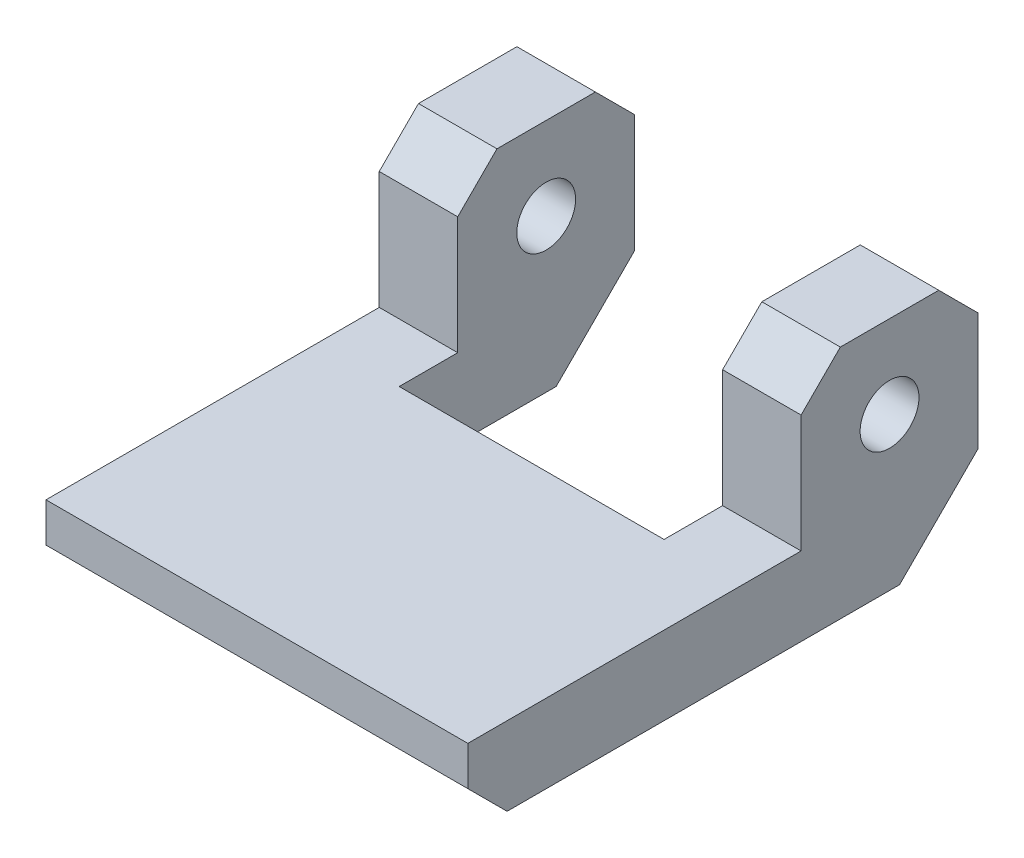
ISO-10303-21;
HEADER;
FILE_DESCRIPTION(('STEP AP214'),'2;1');
FILE_NAME('part.step','',(''),(''),'','','');
FILE_SCHEMA(('AUTOMOTIVE_DESIGN { 1 0 10303 214 1 1 1 1 }'));
ENDSEC;
DATA;
#1=APPLICATION_CONTEXT('core data for automotive mechanical design processes');
#2=APPLICATION_PROTOCOL_DEFINITION('international standard','automotive_design',2000,#1);
#3=PRODUCT_CONTEXT('',#1,'mechanical');
#4=PRODUCT('Part','Part','',(#3));
#5=PRODUCT_RELATED_PRODUCT_CATEGORY('part','',(#4));
#6=PRODUCT_DEFINITION_FORMATION('','',#4);
#7=PRODUCT_DEFINITION_CONTEXT('part definition',#1,'design');
#8=PRODUCT_DEFINITION('design','',#6,#7);
#9=PRODUCT_DEFINITION_SHAPE('','',#8);
#10=(LENGTH_UNIT() NAMED_UNIT(*) SI_UNIT(.MILLI.,.METRE.));
#11=(NAMED_UNIT(*) PLANE_ANGLE_UNIT() SI_UNIT($,.RADIAN.));
#12=(NAMED_UNIT(*) SI_UNIT($,.STERADIAN.) SOLID_ANGLE_UNIT());
#13=UNCERTAINTY_MEASURE_WITH_UNIT(LENGTH_MEASURE(1.E-05),#10,'distance_accuracy_value','');
#14=(GEOMETRIC_REPRESENTATION_CONTEXT(3) GLOBAL_UNCERTAINTY_ASSIGNED_CONTEXT((#13)) GLOBAL_UNIT_ASSIGNED_CONTEXT((#10,
#11,#12)) REPRESENTATION_CONTEXT('',''));
#15=CARTESIAN_POINT('',(0.,0.,0.));
#16=DIRECTION('',(0.,0.,1.));
#17=DIRECTION('',(1.,0.,0.));
#18=AXIS2_PLACEMENT_3D('',#15,#16,#17);
#19=CARTESIAN_POINT('',(0.,12.,0.));
#20=DIRECTION('',(0.,0.,1.));
#21=DIRECTION('',(1.,0.,0.));
#22=AXIS2_PLACEMENT_3D('',#19,#20,#21);
#23=PLANE('',#22);
#24=DIRECTION('',(-1.,0.,0.));
#25=VECTOR('',#24,1.);
#26=CARTESIAN_POINT('',(0.,4.,0.));
#27=LINE('',#26,#25);
#28=CARTESIAN_POINT('',(21.5,4.00000000000001,0.));
#29=VERTEX_POINT('',#28);
#30=CARTESIAN_POINT('',(17.5,4.,0.));
#31=VERTEX_POINT('',#30);
#32=EDGE_CURVE('E293',#29,#31,#27,.T.);
#33=ORIENTED_EDGE('',*,*,#32,.T.);
#34=DIRECTION('',(0.,1.,0.));
#35=VECTOR('',#34,1.);
#36=CARTESIAN_POINT('',(17.5,12.,0.));
#37=LINE('',#36,#35);
#38=CARTESIAN_POINT('',(17.5,9.99999999999999,0.));
#39=VERTEX_POINT('',#38);
#40=EDGE_CURVE('E209',#31,#39,#37,.T.);
#41=ORIENTED_EDGE('',*,*,#40,.T.);
#42=DIRECTION('',(1.,0.,0.));
#43=VECTOR('',#42,1.);
#44=CARTESIAN_POINT('',(21.5,9.99999999999999,0.));
#45=LINE('',#44,#43);
#46=CARTESIAN_POINT('',(21.5,9.99999999999999,0.));
#47=VERTEX_POINT('',#46);
#48=EDGE_CURVE('E280',#39,#47,#45,.T.);
#49=ORIENTED_EDGE('',*,*,#48,.T.);
#50=DIRECTION('',(0.,-1.,0.));
#51=VECTOR('',#50,1.);
#52=CARTESIAN_POINT('',(21.5,12.,0.));
#53=LINE('',#52,#51);
#54=EDGE_CURVE('E260',#47,#29,#53,.T.);
#55=ORIENTED_EDGE('',*,*,#54,.T.);
#56=EDGE_LOOP('',(#33,#41,#49,#55));
#57=FACE_BOUND('',#56,.T.);
#58=ADVANCED_FACE('F31',(#57),#23,.F.);
#59=CARTESIAN_POINT('',(0.,12.,26.));
#60=DIRECTION('',(0.,1.,0.));
#61=DIRECTION('',(0.,0.,1.));
#62=AXIS2_PLACEMENT_3D('',#59,#60,#61);
#63=PLANE('',#62);
#64=DIRECTION('',(0.,0.,-1.));
#65=VECTOR('',#64,1.);
#66=CARTESIAN_POINT('',(17.5,12.,-6.03252210902597));
#67=LINE('',#66,#65);
#68=CARTESIAN_POINT('',(17.5,12.,7.01626105451298));
#69=VERTEX_POINT('',#68);
#70=CARTESIAN_POINT('',(17.5,12.,2.));
#71=VERTEX_POINT('',#70);
#72=EDGE_CURVE('E188',#69,#71,#67,.T.);
#73=ORIENTED_EDGE('',*,*,#72,.F.);
#74=DIRECTION('',(1.,0.,0.));
#75=VECTOR('',#74,1.);
#76=CARTESIAN_POINT('',(21.5,12.,7.01626105451298));
#77=LINE('',#76,#75);
#78=CARTESIAN_POINT('',(21.5,12.,7.01626105451298));
#79=VERTEX_POINT('',#78);
#80=EDGE_CURVE('E268',#69,#79,#77,.T.);
#81=ORIENTED_EDGE('',*,*,#80,.T.);
#82=DIRECTION('',(0.,0.,-1.));
#83=VECTOR('',#82,1.);
#84=CARTESIAN_POINT('',(21.5,12.,0.));
#85=LINE('',#84,#83);
#86=CARTESIAN_POINT('',(21.5,12.,2.));
#87=VERTEX_POINT('',#86);
#88=EDGE_CURVE('E251',#79,#87,#85,.T.);
#89=ORIENTED_EDGE('',*,*,#88,.T.);
#90=DIRECTION('',(-1.,0.,0.));
#91=VECTOR('',#90,1.);
#92=CARTESIAN_POINT('',(0.,12.,2.));
#93=LINE('',#92,#91);
#94=EDGE_CURVE('E273',#87,#71,#93,.T.);
#95=ORIENTED_EDGE('',*,*,#94,.T.);
#96=EDGE_LOOP('',(#73,#81,#89,#95));
#97=FACE_BOUND('',#96,.T.);
#98=ADVANCED_FACE('F334',(#97),#63,.T.);
#99=CARTESIAN_POINT('',(0.,13.0176696078048,9.01626105451299));
#100=DIRECTION('',(0.,0.,-1.));
#101=DIRECTION('',(0.,1.,0.));
#102=AXIS2_PLACEMENT_3D('',#99,#100,#101);
#103=PLANE('',#102);
#104=DIRECTION('',(-1.,0.,0.));
#105=VECTOR('',#104,1.);
#106=CARTESIAN_POINT('',(0.,10.,9.01626105451299));
#107=LINE('',#106,#105);
#108=CARTESIAN_POINT('',(21.5,10.,9.01626105451299));
#109=VERTEX_POINT('',#108);
#110=CARTESIAN_POINT('',(17.5,10.,9.01626105451299));
#111=VERTEX_POINT('',#110);
#112=EDGE_CURVE('E289',#109,#111,#107,.T.);
#113=ORIENTED_EDGE('',*,*,#112,.T.);
#114=DIRECTION('',(0.,-1.,0.));
#115=VECTOR('',#114,1.);
#116=CARTESIAN_POINT('',(17.5,13.0176696078048,9.01626105451299));
#117=LINE('',#116,#115);
#118=CARTESIAN_POINT('',(17.5,4.,9.01626105451299));
#119=VERTEX_POINT('',#118);
#120=EDGE_CURVE('E216',#111,#119,#117,.T.);
#121=ORIENTED_EDGE('',*,*,#120,.T.);
#122=DIRECTION('',(1.,0.,0.));
#123=VECTOR('',#122,1.);
#124=CARTESIAN_POINT('',(0.,4.,9.01626105451299));
#125=LINE('',#124,#123);
#126=CARTESIAN_POINT('',(21.5,4.,9.01626105451299));
#127=VERTEX_POINT('',#126);
#128=EDGE_CURVE('E236',#119,#127,#125,.T.);
#129=ORIENTED_EDGE('',*,*,#128,.T.);
#130=DIRECTION('',(0.,1.,0.));
#131=VECTOR('',#130,1.);
#132=CARTESIAN_POINT('',(21.5,13.0176696078048,9.01626105451299));
#133=LINE('',#132,#131);
#134=EDGE_CURVE('E233',#127,#109,#133,.T.);
#135=ORIENTED_EDGE('',*,*,#134,.T.);
#136=EDGE_LOOP('',(#113,#121,#129,#135));
#137=FACE_BOUND('',#136,.T.);
#138=ADVANCED_FACE('F341',(#137),#103,.F.);
#139=CARTESIAN_POINT('',(0.,12.,2.));
#140=DIRECTION('',(0.,0.707106781186546,-0.707106781186549));
#141=DIRECTION('',(0.,0.707106781186549,0.707106781186546));
#142=AXIS2_PLACEMENT_3D('',#139,#140,#141);
#143=PLANE('',#142);
#144=DIRECTION('',(0.,-0.707106781186549,-0.707106781186546));
#145=VECTOR('',#144,1.);
#146=CARTESIAN_POINT('',(17.5,12.,2.));
#147=LINE('',#146,#145);
#148=EDGE_CURVE('E212',#71,#39,#147,.T.);
#149=ORIENTED_EDGE('',*,*,#148,.F.);
#150=ORIENTED_EDGE('',*,*,#94,.F.);
#151=DIRECTION('',(0.,0.707106781186549,0.707106781186546));
#152=VECTOR('',#151,1.);
#153=CARTESIAN_POINT('',(21.5,12.,2.));
#154=LINE('',#153,#152);
#155=EDGE_CURVE('E286',#47,#87,#154,.T.);
#156=ORIENTED_EDGE('',*,*,#155,.F.);
#157=ORIENTED_EDGE('',*,*,#48,.F.);
#158=EDGE_LOOP('',(#149,#150,#156,#157));
#159=FACE_BOUND('',#158,.T.);
#160=ADVANCED_FACE('F387',(#159),#143,.T.);
#161=CARTESIAN_POINT('',(0.,10.,9.01626105451299));
#162=DIRECTION('',(0.,0.707106781186549,0.707106781186546));
#163=DIRECTION('',(0.,-0.707106781186546,0.707106781186549));
#164=AXIS2_PLACEMENT_3D('',#161,#162,#163);
#165=PLANE('',#164);
#166=DIRECTION('',(0.,0.707106781186546,-0.707106781186549));
#167=VECTOR('',#166,1.);
#168=CARTESIAN_POINT('',(17.5,10.,9.01626105451299));
#169=LINE('',#168,#167);
#170=EDGE_CURVE('E214',#111,#69,#169,.T.);
#171=ORIENTED_EDGE('',*,*,#170,.F.);
#172=ORIENTED_EDGE('',*,*,#112,.F.);
#173=DIRECTION('',(0.,-0.707106781186546,0.707106781186549));
#174=VECTOR('',#173,1.);
#175=CARTESIAN_POINT('',(21.5,10.,9.01626105451299));
#176=LINE('',#175,#174);
#177=EDGE_CURVE('E284',#79,#109,#176,.T.);
#178=ORIENTED_EDGE('',*,*,#177,.F.);
#179=ORIENTED_EDGE('',*,*,#80,.F.);
#180=EDGE_LOOP('',(#171,#172,#178,#179));
#181=FACE_BOUND('',#180,.T.);
#182=ADVANCED_FACE('F395',(#181),#165,.T.);
#183=CARTESIAN_POINT('',(0.,4.,0.));
#184=DIRECTION('',(0.,0.707106781186549,0.707106781186546));
#185=DIRECTION('',(0.,-0.707106781186546,0.707106781186549));
#186=AXIS2_PLACEMENT_3D('',#183,#184,#185);
#187=PLANE('',#186);
#188=DIRECTION('',(0.,0.707106781186546,-0.707106781186549));
#189=VECTOR('',#188,1.);
#190=CARTESIAN_POINT('',(17.5,4.,0.));
#191=LINE('',#190,#189);
#192=CARTESIAN_POINT('',(17.5,0.,4.00000000000002));
#193=VERTEX_POINT('',#192);
#194=EDGE_CURVE('E207',#31,#193,#191,.F.);
#195=ORIENTED_EDGE('',*,*,#194,.F.);
#196=ORIENTED_EDGE('',*,*,#32,.F.);
#197=DIRECTION('',(0.,-0.707106781186546,0.707106781186549));
#198=VECTOR('',#197,1.);
#199=CARTESIAN_POINT('',(21.5,4.00000000000001,0.));
#200=LINE('',#199,#198);
#201=CARTESIAN_POINT('',(21.5,0.,4.00000000000002));
#202=VERTEX_POINT('',#201);
#203=EDGE_CURVE('E300',#202,#29,#200,.F.);
#204=ORIENTED_EDGE('',*,*,#203,.F.);
#205=DIRECTION('',(1.,0.,0.));
#206=VECTOR('',#205,1.);
#207=CARTESIAN_POINT('',(0.,0.,4.00000000000002));
#208=LINE('',#207,#206);
#209=EDGE_CURVE('E298',#193,#202,#208,.T.);
#210=ORIENTED_EDGE('',*,*,#209,.F.);
#211=EDGE_LOOP('',(#195,#196,#204,#210));
#212=FACE_BOUND('',#211,.T.);
#213=ADVANCED_FACE('F380',(#212),#187,.F.);
#214=CARTESIAN_POINT('',(0.,7.77705431232267,4.50813052725649));
#215=DIRECTION('',(1.,0.,0.));
#216=DIRECTION('',(0.,0.,-1.));
#217=AXIS2_PLACEMENT_3D('',#214,#215,#216);
#218=CYLINDRICAL_SURFACE('',#217,1.5);
#219=CARTESIAN_POINT('',(17.5,7.77705431232267,4.50813052725649));
#220=DIRECTION('',(1.,0.,0.));
#221=DIRECTION('',(0.,0.,-1.));
#222=AXIS2_PLACEMENT_3D('',#219,#220,#221);
#223=CIRCLE('',#222,1.5);
#224=CARTESIAN_POINT('',(17.5,7.77705431232267,3.00813052725649));
#225=VERTEX_POINT('',#224);
#226=EDGE_CURVE('E206',#225,#225,#223,.F.);
#227=ORIENTED_EDGE('',*,*,#226,.T.);
#228=EDGE_LOOP('',(#227));
#229=FACE_BOUND('',#228,.T.);
#230=CARTESIAN_POINT('',(21.5,7.77705431232267,4.50813052725649));
#231=DIRECTION('',(1.,0.,0.));
#232=DIRECTION('',(0.,0.,-1.));
#233=AXIS2_PLACEMENT_3D('',#230,#231,#232);
#234=CIRCLE('',#233,1.5);
#235=CARTESIAN_POINT('',(21.5,7.77705431232267,3.00813052725649));
#236=VERTEX_POINT('',#235);
#237=EDGE_CURVE('E222',#236,#236,#234,.T.);
#238=ORIENTED_EDGE('',*,*,#237,.T.);
#239=EDGE_LOOP('',(#238));
#240=FACE_BOUND('',#239,.T.);
#241=ADVANCED_FACE('F466',(#229,#240),#218,.F.);
#242=CARTESIAN_POINT('',(0.,12.,0.));
#243=DIRECTION('',(1.,0.,0.));
#244=DIRECTION('',(0.,0.,-1.));
#245=AXIS2_PLACEMENT_3D('',#242,#243,#244);
#246=PLANE('',#245);
#247=CARTESIAN_POINT('',(0.,7.77705431232267,4.50813052725649));
#248=DIRECTION('',(1.,0.,0.));
#249=DIRECTION('',(0.,0.,-1.));
#250=AXIS2_PLACEMENT_3D('',#247,#248,#249);
#251=CIRCLE('',#250,1.5);
#252=CARTESIAN_POINT('',(0.,7.77705431232267,3.00813052725649));
#253=VERTEX_POINT('',#252);
#254=EDGE_CURVE('E223',#253,#253,#251,.T.);
#255=ORIENTED_EDGE('',*,*,#254,.T.);
#256=EDGE_LOOP('',(#255));
#257=FACE_BOUND('',#256,.T.);
#258=DIRECTION('',(0.,0.,1.));
#259=VECTOR('',#258,1.);
#260=CARTESIAN_POINT('',(0.,0.,0.));
#261=LINE('',#260,#259);
#262=CARTESIAN_POINT('',(0.,0.,4.00000000000002));
#263=VERTEX_POINT('',#262);
#264=CARTESIAN_POINT('',(0.,0.,24.));
#265=VERTEX_POINT('',#264);
#266=EDGE_CURVE('E247',#263,#265,#261,.T.);
#267=ORIENTED_EDGE('',*,*,#266,.T.);
#268=DIRECTION('',(0.,-0.707106781186546,-0.707106781186549));
#269=VECTOR('',#268,1.);
#270=CARTESIAN_POINT('',(0.,1.99999999999999,26.));
#271=LINE('',#270,#269);
#272=CARTESIAN_POINT('',(0.,1.99999999999999,26.));
#273=VERTEX_POINT('',#272);
#274=EDGE_CURVE('E11',#265,#273,#271,.F.);
#275=ORIENTED_EDGE('',*,*,#274,.T.);
#276=DIRECTION('',(0.,-1.,0.));
#277=VECTOR('',#276,1.);
#278=CARTESIAN_POINT('',(0.,12.,26.));
#279=LINE('',#278,#277);
#280=CARTESIAN_POINT('',(0.,4.,26.));
#281=VERTEX_POINT('',#280);
#282=EDGE_CURVE('E265',#281,#273,#279,.T.);
#283=ORIENTED_EDGE('',*,*,#282,.F.);
#284=DIRECTION('',(0.,0.,-1.));
#285=VECTOR('',#284,1.);
#286=CARTESIAN_POINT('',(0.,4.,31.4384801314986));
#287=LINE('',#286,#285);
#288=CARTESIAN_POINT('',(0.,4.,9.01626105451299));
#289=VERTEX_POINT('',#288);
#290=EDGE_CURVE('E229',#281,#289,#287,.T.);
#291=ORIENTED_EDGE('',*,*,#290,.T.);
#292=DIRECTION('',(0.,1.,0.));
#293=VECTOR('',#292,1.);
#294=CARTESIAN_POINT('',(0.,13.0176696078048,9.01626105451299));
#295=LINE('',#294,#293);
#296=CARTESIAN_POINT('',(0.,10.,9.01626105451299));
#297=VERTEX_POINT('',#296);
#298=EDGE_CURVE('E232',#289,#297,#295,.T.);
#299=ORIENTED_EDGE('',*,*,#298,.T.);
#300=DIRECTION('',(0.,0.707106781186546,-0.707106781186549));
#301=VECTOR('',#300,1.);
#302=CARTESIAN_POINT('',(0.,10.,9.01626105451299));
#303=LINE('',#302,#301);
#304=CARTESIAN_POINT('',(0.,12.,7.01626105451298));
#305=VERTEX_POINT('',#304);
#306=EDGE_CURVE('E276',#297,#305,#303,.T.);
#307=ORIENTED_EDGE('',*,*,#306,.T.);
#308=DIRECTION('',(0.,0.,1.));
#309=VECTOR('',#308,1.);
#310=CARTESIAN_POINT('',(0.,12.,0.));
#311=LINE('',#310,#309);
#312=CARTESIAN_POINT('',(0.,12.,2.));
#313=VERTEX_POINT('',#312);
#314=EDGE_CURVE('E248',#313,#305,#311,.T.);
#315=ORIENTED_EDGE('',*,*,#314,.F.);
#316=DIRECTION('',(0.,-0.707106781186549,-0.707106781186546));
#317=VECTOR('',#316,1.);
#318=CARTESIAN_POINT('',(0.,12.,2.));
#319=LINE('',#318,#317);
#320=CARTESIAN_POINT('',(0.,9.99999999999999,0.));
#321=VERTEX_POINT('',#320);
#322=EDGE_CURVE('E278',#313,#321,#319,.T.);
#323=ORIENTED_EDGE('',*,*,#322,.T.);
#324=DIRECTION('',(0.,-1.,0.));
#325=VECTOR('',#324,1.);
#326=CARTESIAN_POINT('',(0.,12.,0.));
#327=LINE('',#326,#325);
#328=CARTESIAN_POINT('',(0.,4.00000000000001,0.));
#329=VERTEX_POINT('',#328);
#330=EDGE_CURVE('E255',#321,#329,#327,.T.);
#331=ORIENTED_EDGE('',*,*,#330,.T.);
#332=DIRECTION('',(0.,0.707106781186546,-0.707106781186549));
#333=VECTOR('',#332,1.);
#334=CARTESIAN_POINT('',(0.,4.,0.));
#335=LINE('',#334,#333);
#336=EDGE_CURVE('E296',#329,#263,#335,.F.);
#337=ORIENTED_EDGE('',*,*,#336,.T.);
#338=EDGE_LOOP('',(#267,#275,#283,#291,#299,#307,#315,#323,#331,#337));
#339=FACE_BOUND('',#338,.T.);
#340=ADVANCED_FACE('F325',(#257,#339),#246,.F.);
#341=CARTESIAN_POINT('',(0.,12.,26.));
#342=DIRECTION('',(0.,0.,-1.));
#343=DIRECTION('',(-1.,0.,0.));
#344=AXIS2_PLACEMENT_3D('',#341,#342,#343);
#345=PLANE('',#344);
#346=ORIENTED_EDGE('',*,*,#282,.T.);
#347=DIRECTION('',(1.,0.,0.));
#348=VECTOR('',#347,1.);
#349=CARTESIAN_POINT('',(0.,1.99999999999999,26.));
#350=LINE('',#349,#348);
#351=CARTESIAN_POINT('',(21.5,1.99999999999999,26.));
#352=VERTEX_POINT('',#351);
#353=EDGE_CURVE('E308',#273,#352,#350,.T.);
#354=ORIENTED_EDGE('',*,*,#353,.T.);
#355=DIRECTION('',(0.,-1.,0.));
#356=VECTOR('',#355,1.);
#357=CARTESIAN_POINT('',(21.5,12.,26.));
#358=LINE('',#357,#356);
#359=CARTESIAN_POINT('',(21.5,4.,26.));
#360=VERTEX_POINT('',#359);
#361=EDGE_CURVE('E263',#360,#352,#358,.T.);
#362=ORIENTED_EDGE('',*,*,#361,.F.);
#363=DIRECTION('',(-1.,0.,0.));
#364=VECTOR('',#363,1.);
#365=CARTESIAN_POINT('',(0.,4.,26.));
#366=LINE('',#365,#364);
#367=EDGE_CURVE('E244',#360,#281,#366,.T.);
#368=ORIENTED_EDGE('',*,*,#367,.T.);
#369=EDGE_LOOP('',(#346,#354,#362,#368));
#370=FACE_BOUND('',#369,.T.);
#371=ADVANCED_FACE('F314',(#370),#345,.F.);
#372=CARTESIAN_POINT('',(21.5,12.,0.));
#373=DIRECTION('',(-1.,0.,0.));
#374=DIRECTION('',(0.,0.,1.));
#375=AXIS2_PLACEMENT_3D('',#372,#373,#374);
#376=PLANE('',#375);
#377=ORIENTED_EDGE('',*,*,#237,.F.);
#378=EDGE_LOOP('',(#377));
#379=FACE_BOUND('',#378,.T.);
#380=ORIENTED_EDGE('',*,*,#361,.T.);
#381=DIRECTION('',(0.,0.707106781186546,0.707106781186549));
#382=VECTOR('',#381,1.);
#383=CARTESIAN_POINT('',(21.5,1.99999999999999,26.));
#384=LINE('',#383,#382);
#385=CARTESIAN_POINT('',(21.5,0.,24.));
#386=VERTEX_POINT('',#385);
#387=EDGE_CURVE('E53',#352,#386,#384,.F.);
#388=ORIENTED_EDGE('',*,*,#387,.T.);
#389=DIRECTION('',(0.,0.,-1.));
#390=VECTOR('',#389,1.);
#391=CARTESIAN_POINT('',(21.5,0.,0.));
#392=LINE('',#391,#390);
#393=EDGE_CURVE('E252',#386,#202,#392,.T.);
#394=ORIENTED_EDGE('',*,*,#393,.T.);
#395=ORIENTED_EDGE('',*,*,#203,.T.);
#396=ORIENTED_EDGE('',*,*,#54,.F.);
#397=ORIENTED_EDGE('',*,*,#155,.T.);
#398=ORIENTED_EDGE('',*,*,#88,.F.);
#399=ORIENTED_EDGE('',*,*,#177,.T.);
#400=ORIENTED_EDGE('',*,*,#134,.F.);
#401=DIRECTION('',(0.,0.,-1.));
#402=VECTOR('',#401,1.);
#403=CARTESIAN_POINT('',(21.5,4.,31.4384801314986));
#404=LINE('',#403,#402);
#405=EDGE_CURVE('E226',#360,#127,#404,.T.);
#406=ORIENTED_EDGE('',*,*,#405,.F.);
#407=EDGE_LOOP('',(#380,#388,#394,#395,#396,#397,#398,#399,#400,#406));
#408=FACE_BOUND('',#407,.T.);
#409=ADVANCED_FACE('F319',(#379,#408),#376,.F.);
#410=CARTESIAN_POINT('',(4.,9.99999999999999,0.));
#411=VERTEX_POINT('',#410);
#412=EDGE_CURVE('E281',#321,#411,#45,.T.);
#413=ORIENTED_EDGE('',*,*,#412,.T.);
#414=DIRECTION('',(0.,-1.,0.));
#415=VECTOR('',#414,1.);
#416=CARTESIAN_POINT('',(4.,12.,0.));
#417=LINE('',#416,#415);
#418=CARTESIAN_POINT('',(4.,4.,0.));
#419=VERTEX_POINT('',#418);
#420=EDGE_CURVE('E195',#411,#419,#417,.T.);
#421=ORIENTED_EDGE('',*,*,#420,.T.);
#422=EDGE_CURVE('E292',#419,#329,#27,.T.);
#423=ORIENTED_EDGE('',*,*,#422,.T.);
#424=ORIENTED_EDGE('',*,*,#330,.F.);
#425=EDGE_LOOP('',(#413,#421,#423,#424));
#426=FACE_BOUND('',#425,.T.);
#427=ADVANCED_FACE('F337',(#426),#23,.F.);
#428=DIRECTION('',(0.,0.,1.));
#429=VECTOR('',#428,1.);
#430=CARTESIAN_POINT('',(4.,12.,-6.03252210902597));
#431=LINE('',#430,#429);
#432=CARTESIAN_POINT('',(4.,12.,2.));
#433=VERTEX_POINT('',#432);
#434=CARTESIAN_POINT('',(4.,12.,7.01626105451298));
#435=VERTEX_POINT('',#434);
#436=EDGE_CURVE('E185',#433,#435,#431,.T.);
#437=ORIENTED_EDGE('',*,*,#436,.F.);
#438=EDGE_CURVE('E272',#433,#313,#93,.T.);
#439=ORIENTED_EDGE('',*,*,#438,.T.);
#440=ORIENTED_EDGE('',*,*,#314,.T.);
#441=EDGE_CURVE('E269',#305,#435,#77,.T.);
#442=ORIENTED_EDGE('',*,*,#441,.T.);
#443=EDGE_LOOP('',(#437,#439,#440,#442));
#444=FACE_BOUND('',#443,.T.);
#445=ADVANCED_FACE('F344',(#444),#63,.T.);
#446=CARTESIAN_POINT('',(0.,0.,26.));
#447=DIRECTION('',(0.,1.,0.));
#448=DIRECTION('',(0.,0.,1.));
#449=AXIS2_PLACEMENT_3D('',#446,#447,#448);
#450=PLANE('',#449);
#451=ORIENTED_EDGE('',*,*,#393,.F.);
#452=DIRECTION('',(-1.,0.,0.));
#453=VECTOR('',#452,1.);
#454=CARTESIAN_POINT('',(0.,0.,24.));
#455=LINE('',#454,#453);
#456=EDGE_CURVE('E39',#386,#265,#455,.T.);
#457=ORIENTED_EDGE('',*,*,#456,.T.);
#458=ORIENTED_EDGE('',*,*,#266,.F.);
#459=CARTESIAN_POINT('',(4.,0.,4.00000000000002));
#460=VERTEX_POINT('',#459);
#461=EDGE_CURVE('E182',#263,#460,#208,.T.);
#462=ORIENTED_EDGE('',*,*,#461,.T.);
#463=DIRECTION('',(0.,0.,1.));
#464=VECTOR('',#463,1.);
#465=CARTESIAN_POINT('',(4.,0.,-6.03252210902597));
#466=LINE('',#465,#464);
#467=CARTESIAN_POINT('',(4.,0.,12.));
#468=VERTEX_POINT('',#467);
#469=EDGE_CURVE('E164',#460,#468,#466,.T.);
#470=ORIENTED_EDGE('',*,*,#469,.T.);
#471=DIRECTION('',(1.,0.,0.));
#472=VECTOR('',#471,1.);
#473=CARTESIAN_POINT('',(4.,0.,12.));
#474=LINE('',#473,#472);
#475=CARTESIAN_POINT('',(17.5,0.,12.));
#476=VERTEX_POINT('',#475);
#477=EDGE_CURVE('E171',#468,#476,#474,.T.);
#478=ORIENTED_EDGE('',*,*,#477,.T.);
#479=DIRECTION('',(0.,0.,-1.));
#480=VECTOR('',#479,1.);
#481=CARTESIAN_POINT('',(17.5,0.,-6.03252210902597));
#482=LINE('',#481,#480);
#483=EDGE_CURVE('E183',#476,#193,#482,.T.);
#484=ORIENTED_EDGE('',*,*,#483,.T.);
#485=ORIENTED_EDGE('',*,*,#209,.T.);
#486=EDGE_LOOP('',(#451,#457,#458,#462,#470,#478,#484,#485));
#487=FACE_BOUND('',#486,.T.);
#488=ADVANCED_FACE('F180',(#487),#450,.F.);
#489=CARTESIAN_POINT('',(0.,4.,31.4384801314986));
#490=DIRECTION('',(0.,-1.,0.));
#491=DIRECTION('',(0.,0.,-1.));
#492=AXIS2_PLACEMENT_3D('',#489,#490,#491);
#493=PLANE('',#492);
#494=ORIENTED_EDGE('',*,*,#128,.F.);
#495=DIRECTION('',(0.,0.,1.));
#496=VECTOR('',#495,1.);
#497=CARTESIAN_POINT('',(17.5,4.,31.4384801314986));
#498=LINE('',#497,#496);
#499=CARTESIAN_POINT('',(17.5,4.,12.));
#500=VERTEX_POINT('',#499);
#501=EDGE_CURVE('E219',#119,#500,#498,.T.);
#502=ORIENTED_EDGE('',*,*,#501,.T.);
#503=DIRECTION('',(-1.,0.,0.));
#504=VECTOR('',#503,1.);
#505=CARTESIAN_POINT('',(0.,4.,12.));
#506=LINE('',#505,#504);
#507=CARTESIAN_POINT('',(4.,4.,12.));
#508=VERTEX_POINT('',#507);
#509=EDGE_CURVE('E302',#500,#508,#506,.T.);
#510=ORIENTED_EDGE('',*,*,#509,.T.);
#511=DIRECTION('',(0.,0.,-1.));
#512=VECTOR('',#511,1.);
#513=CARTESIAN_POINT('',(4.,4.,31.4384801314986));
#514=LINE('',#513,#512);
#515=CARTESIAN_POINT('',(4.,4.,9.01626105451299));
#516=VERTEX_POINT('',#515);
#517=EDGE_CURVE('E167',#508,#516,#514,.T.);
#518=ORIENTED_EDGE('',*,*,#517,.T.);
#519=EDGE_CURVE('E241',#289,#516,#125,.T.);
#520=ORIENTED_EDGE('',*,*,#519,.F.);
#521=ORIENTED_EDGE('',*,*,#290,.F.);
#522=ORIENTED_EDGE('',*,*,#367,.F.);
#523=ORIENTED_EDGE('',*,*,#405,.T.);
#524=EDGE_LOOP('',(#494,#502,#510,#518,#520,#521,#522,#523));
#525=FACE_BOUND('',#524,.T.);
#526=ADVANCED_FACE('F323',(#525),#493,.F.);
#527=ORIENTED_EDGE('',*,*,#519,.T.);
#528=DIRECTION('',(0.,1.,0.));
#529=VECTOR('',#528,1.);
#530=CARTESIAN_POINT('',(4.,13.0176696078048,9.01626105451299));
#531=LINE('',#530,#529);
#532=CARTESIAN_POINT('',(4.,10.,9.01626105451299));
#533=VERTEX_POINT('',#532);
#534=EDGE_CURVE('E202',#516,#533,#531,.T.);
#535=ORIENTED_EDGE('',*,*,#534,.T.);
#536=EDGE_CURVE('E288',#533,#297,#107,.T.);
#537=ORIENTED_EDGE('',*,*,#536,.T.);
#538=ORIENTED_EDGE('',*,*,#298,.F.);
#539=EDGE_LOOP('',(#527,#535,#537,#538));
#540=FACE_BOUND('',#539,.T.);
#541=ADVANCED_FACE('F372',(#540),#103,.F.);
#542=DIRECTION('',(0.,0.707106781186549,0.707106781186546));
#543=VECTOR('',#542,1.);
#544=CARTESIAN_POINT('',(4.,12.,2.));
#545=LINE('',#544,#543);
#546=EDGE_CURVE('E198',#411,#433,#545,.T.);
#547=ORIENTED_EDGE('',*,*,#546,.F.);
#548=ORIENTED_EDGE('',*,*,#412,.F.);
#549=ORIENTED_EDGE('',*,*,#322,.F.);
#550=ORIENTED_EDGE('',*,*,#438,.F.);
#551=EDGE_LOOP('',(#547,#548,#549,#550));
#552=FACE_BOUND('',#551,.T.);
#553=ADVANCED_FACE('F361',(#552),#143,.T.);
#554=DIRECTION('',(0.,-0.707106781186546,0.707106781186549));
#555=VECTOR('',#554,1.);
#556=CARTESIAN_POINT('',(4.,10.,9.01626105451299));
#557=LINE('',#556,#555);
#558=EDGE_CURVE('E200',#435,#533,#557,.T.);
#559=ORIENTED_EDGE('',*,*,#558,.F.);
#560=ORIENTED_EDGE('',*,*,#441,.F.);
#561=ORIENTED_EDGE('',*,*,#306,.F.);
#562=ORIENTED_EDGE('',*,*,#536,.F.);
#563=EDGE_LOOP('',(#559,#560,#561,#562));
#564=FACE_BOUND('',#563,.T.);
#565=ADVANCED_FACE('F369',(#564),#165,.T.);
#566=DIRECTION('',(0.,-0.707106781186546,0.707106781186549));
#567=VECTOR('',#566,1.);
#568=CARTESIAN_POINT('',(4.,4.,0.));
#569=LINE('',#568,#567);
#570=EDGE_CURVE('E193',#460,#419,#569,.F.);
#571=ORIENTED_EDGE('',*,*,#570,.F.);
#572=ORIENTED_EDGE('',*,*,#461,.F.);
#573=ORIENTED_EDGE('',*,*,#336,.F.);
#574=ORIENTED_EDGE('',*,*,#422,.F.);
#575=EDGE_LOOP('',(#571,#572,#573,#574));
#576=FACE_BOUND('',#575,.T.);
#577=ADVANCED_FACE('F447',(#576),#187,.F.);
#578=CARTESIAN_POINT('',(4.,7.77705431232267,4.50813052725649));
#579=DIRECTION('',(-1.,0.,0.));
#580=DIRECTION('',(0.,0.,1.));
#581=AXIS2_PLACEMENT_3D('',#578,#579,#580);
#582=CIRCLE('',#581,1.5);
#583=CARTESIAN_POINT('',(4.,7.77705431232267,6.00813052725649));
#584=VERTEX_POINT('',#583);
#585=EDGE_CURVE('E191',#584,#584,#582,.F.);
#586=ORIENTED_EDGE('',*,*,#585,.T.);
#587=EDGE_LOOP('',(#586));
#588=FACE_BOUND('',#587,.T.);
#589=ORIENTED_EDGE('',*,*,#254,.F.);
#590=EDGE_LOOP('',(#589));
#591=FACE_BOUND('',#590,.T.);
#592=ADVANCED_FACE('F456',(#588,#591),#218,.F.);
#593=CARTESIAN_POINT('',(4.,0.,12.));
#594=DIRECTION('',(0.,0.,1.));
#595=DIRECTION('',(1.,0.,0.));
#596=AXIS2_PLACEMENT_3D('',#593,#594,#595);
#597=PLANE('',#596);
#598=DIRECTION('',(0.,1.,0.));
#599=VECTOR('',#598,1.);
#600=CARTESIAN_POINT('',(17.5,0.,12.));
#601=LINE('',#600,#599);
#602=EDGE_CURVE('E170',#476,#500,#601,.T.);
#603=ORIENTED_EDGE('',*,*,#602,.F.);
#604=ORIENTED_EDGE('',*,*,#477,.F.);
#605=DIRECTION('',(0.,1.,0.));
#606=VECTOR('',#605,1.);
#607=CARTESIAN_POINT('',(4.,0.,12.));
#608=LINE('',#607,#606);
#609=EDGE_CURVE('E160',#468,#508,#608,.T.);
#610=ORIENTED_EDGE('',*,*,#609,.T.);
#611=ORIENTED_EDGE('',*,*,#509,.F.);
#612=EDGE_LOOP('',(#603,#604,#610,#611));
#613=FACE_BOUND('',#612,.T.);
#614=ADVANCED_FACE('F174',(#613),#597,.F.);
#615=CARTESIAN_POINT('',(17.5,0.,-6.03252210902597));
#616=DIRECTION('',(1.,0.,0.));
#617=DIRECTION('',(0.,0.,-1.));
#618=AXIS2_PLACEMENT_3D('',#615,#616,#617);
#619=PLANE('',#618);
#620=ORIENTED_EDGE('',*,*,#226,.F.);
#621=EDGE_LOOP('',(#620));
#622=FACE_BOUND('',#621,.T.);
#623=ORIENTED_EDGE('',*,*,#120,.F.);
#624=ORIENTED_EDGE('',*,*,#170,.T.);
#625=ORIENTED_EDGE('',*,*,#72,.T.);
#626=ORIENTED_EDGE('',*,*,#148,.T.);
#627=ORIENTED_EDGE('',*,*,#40,.F.);
#628=ORIENTED_EDGE('',*,*,#194,.T.);
#629=ORIENTED_EDGE('',*,*,#483,.F.);
#630=ORIENTED_EDGE('',*,*,#602,.T.);
#631=ORIENTED_EDGE('',*,*,#501,.F.);
#632=EDGE_LOOP('',(#623,#624,#625,#626,#627,#628,#629,#630,#631));
#633=FACE_BOUND('',#632,.T.);
#634=ADVANCED_FACE('F330',(#622,#633),#619,.F.);
#635=CARTESIAN_POINT('',(4.,0.,-6.03252210902597));
#636=DIRECTION('',(-1.,0.,0.));
#637=DIRECTION('',(0.,0.,1.));
#638=AXIS2_PLACEMENT_3D('',#635,#636,#637);
#639=PLANE('',#638);
#640=ORIENTED_EDGE('',*,*,#585,.F.);
#641=EDGE_LOOP('',(#640));
#642=FACE_BOUND('',#641,.T.);
#643=ORIENTED_EDGE('',*,*,#609,.F.);
#644=ORIENTED_EDGE('',*,*,#469,.F.);
#645=ORIENTED_EDGE('',*,*,#570,.T.);
#646=ORIENTED_EDGE('',*,*,#420,.F.);
#647=ORIENTED_EDGE('',*,*,#546,.T.);
#648=ORIENTED_EDGE('',*,*,#436,.T.);
#649=ORIENTED_EDGE('',*,*,#558,.T.);
#650=ORIENTED_EDGE('',*,*,#534,.F.);
#651=ORIENTED_EDGE('',*,*,#517,.F.);
#652=EDGE_LOOP('',(#643,#644,#645,#646,#647,#648,#649,#650,#651));
#653=FACE_BOUND('',#652,.T.);
#654=ADVANCED_FACE('F162',(#642,#653),#639,.F.);
#655=CARTESIAN_POINT('',(0.,1.99999999999999,26.));
#656=DIRECTION('',(0.,0.707106781186549,-0.707106781186546));
#657=DIRECTION('',(0.,0.707106781186546,0.707106781186549));
#658=AXIS2_PLACEMENT_3D('',#655,#656,#657);
#659=PLANE('',#658);
#660=ORIENTED_EDGE('',*,*,#274,.F.);
#661=ORIENTED_EDGE('',*,*,#456,.F.);
#662=ORIENTED_EDGE('',*,*,#387,.F.);
#663=ORIENTED_EDGE('',*,*,#353,.F.);
#664=EDGE_LOOP('',(#660,#661,#662,#663));
#665=FACE_BOUND('',#664,.T.);
#666=ADVANCED_FACE('F33',(#665),#659,.F.);
#667=CLOSED_SHELL('',(#58,#98,#138,#160,#182,#213,#241,#340,#371,#409,#427,#445,#488,#526,#541,
#553,#565,#577,#592,#614,#634,#654,#666));
#668=MANIFOLD_SOLID_BREP('B2',#667);
#669=ADVANCED_BREP_SHAPE_REPRESENTATION('',(#18,#668),#14);
#670=SHAPE_DEFINITION_REPRESENTATION(#9,#669);
ENDSEC;
END-ISO-10303-21;
